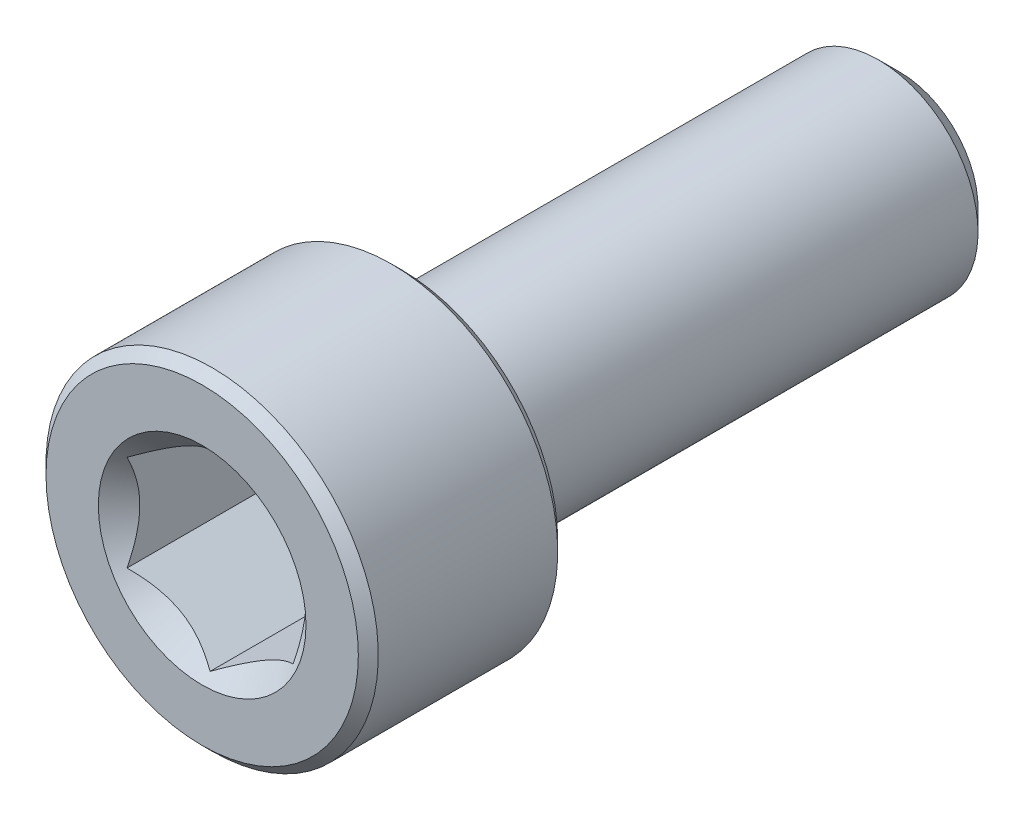
ISO-10303-21;
HEADER;
FILE_DESCRIPTION(('STEP AP214'),'2;1');
FILE_NAME('part.step','',(''),(''),'','','');
FILE_SCHEMA(('AUTOMOTIVE_DESIGN { 1 0 10303 214 1 1 1 1 }'));
ENDSEC;
DATA;
#1=APPLICATION_CONTEXT('core data for automotive mechanical design processes');
#2=APPLICATION_PROTOCOL_DEFINITION('international standard','automotive_design',2000,#1);
#3=PRODUCT_CONTEXT('',#1,'mechanical');
#4=PRODUCT('Part','Part','',(#3));
#5=PRODUCT_RELATED_PRODUCT_CATEGORY('part','',(#4));
#6=PRODUCT_DEFINITION_FORMATION('','',#4);
#7=PRODUCT_DEFINITION_CONTEXT('part definition',#1,'design');
#8=PRODUCT_DEFINITION('design','',#6,#7);
#9=PRODUCT_DEFINITION_SHAPE('','',#8);
#10=(LENGTH_UNIT() NAMED_UNIT(*) SI_UNIT(.MILLI.,.METRE.));
#11=(NAMED_UNIT(*) PLANE_ANGLE_UNIT() SI_UNIT($,.RADIAN.));
#12=(NAMED_UNIT(*) SI_UNIT($,.STERADIAN.) SOLID_ANGLE_UNIT());
#13=UNCERTAINTY_MEASURE_WITH_UNIT(LENGTH_MEASURE(1.E-05),#10,'distance_accuracy_value','');
#14=(GEOMETRIC_REPRESENTATION_CONTEXT(3) GLOBAL_UNCERTAINTY_ASSIGNED_CONTEXT((#13)) GLOBAL_UNIT_ASSIGNED_CONTEXT((#10,
#11,#12)) REPRESENTATION_CONTEXT('',''));
#15=CARTESIAN_POINT('',(0.,0.,0.));
#16=DIRECTION('',(0.,0.,1.));
#17=DIRECTION('',(1.,0.,0.));
#18=AXIS2_PLACEMENT_3D('',#15,#16,#17);
#19=CARTESIAN_POINT('',(0.,2.35048094716167,-10.5));
#20=DIRECTION('',(0.,0.,-1.));
#21=DIRECTION('',(0.,1.,0.));
#22=AXIS2_PLACEMENT_3D('',#19,#20,#21);
#23=PLANE('',#22);
#24=CARTESIAN_POINT('',(0.,0.,-10.5));
#25=DIRECTION('',(0.,0.,-1.));
#26=DIRECTION('',(0.,1.,0.));
#27=AXIS2_PLACEMENT_3D('',#24,#25,#26);
#28=CIRCLE('',#27,2.35048094716167);
#29=CARTESIAN_POINT('',(0.,2.35048094716167,-10.5));
#30=VERTEX_POINT('',#29);
#31=EDGE_CURVE('E54',#30,#30,#28,.T.);
#32=ORIENTED_EDGE('',*,*,#31,.T.);
#33=EDGE_LOOP('',(#32));
#34=FACE_BOUND('',#33,.T.);
#35=ADVANCED_FACE('F41',(#34),#23,.T.);
#36=CARTESIAN_POINT('',(0.,0.,-10.5));
#37=DIRECTION('',(0.,0.,1.));
#38=DIRECTION('',(0.,-1.,0.));
#39=AXIS2_PLACEMENT_3D('',#36,#37,#38);
#40=CONICAL_SURFACE('',#39,2.35048094716167,0.785398163397447);
#41=CARTESIAN_POINT('',(0.,0.,-9.85048094716167));
#42=DIRECTION('',(0.,0.,-1.));
#43=DIRECTION('',(0.,1.,0.));
#44=AXIS2_PLACEMENT_3D('',#41,#42,#43);
#45=CIRCLE('',#44,3.);
#46=CARTESIAN_POINT('',(0.,3.,-9.85048094716167));
#47=VERTEX_POINT('',#46);
#48=EDGE_CURVE('E157',#47,#47,#45,.T.);
#49=ORIENTED_EDGE('',*,*,#48,.T.);
#50=EDGE_LOOP('',(#49));
#51=FACE_BOUND('',#50,.T.);
#52=ORIENTED_EDGE('',*,*,#31,.F.);
#53=EDGE_LOOP('',(#52));
#54=FACE_BOUND('',#53,.T.);
#55=ADVANCED_FACE('F163',(#51,#54),#40,.T.);
#56=CARTESIAN_POINT('',(0.,0.,-10.5));
#57=DIRECTION('',(0.,0.,-1.));
#58=DIRECTION('',(0.,1.,0.));
#59=AXIS2_PLACEMENT_3D('',#56,#57,#58);
#60=CYLINDRICAL_SURFACE('',#59,3.);
#61=CARTESIAN_POINT('',(0.,0.,4.2));
#62=DIRECTION('',(0.,0.,-1.));
#63=DIRECTION('',(0.,1.,0.));
#64=AXIS2_PLACEMENT_3D('',#61,#62,#63);
#65=CIRCLE('',#64,3.);
#66=CARTESIAN_POINT('',(0.,3.,4.2));
#67=VERTEX_POINT('',#66);
#68=EDGE_CURVE('E154',#67,#67,#65,.T.);
#69=ORIENTED_EDGE('',*,*,#68,.T.);
#70=EDGE_LOOP('',(#69));
#71=FACE_BOUND('',#70,.T.);
#72=ORIENTED_EDGE('',*,*,#48,.F.);
#73=EDGE_LOOP('',(#72));
#74=FACE_BOUND('',#73,.T.);
#75=ADVANCED_FACE('F165',(#71,#74),#60,.T.);
#76=CARTESIAN_POINT('',(0.,0.,4.2));
#77=DIRECTION('',(0.,0.,-1.));
#78=DIRECTION('',(0.,1.,0.));
#79=AXIS2_PLACEMENT_3D('',#76,#77,#78);
#80=TOROIDAL_SURFACE('',#79,3.3,0.299999999999999);
#81=CARTESIAN_POINT('',(0.,0.,4.5));
#82=DIRECTION('',(0.,0.,-1.));
#83=DIRECTION('',(0.,1.,0.));
#84=AXIS2_PLACEMENT_3D('',#81,#82,#83);
#85=CIRCLE('',#84,3.3);
#86=CARTESIAN_POINT('',(0.,3.3,4.5));
#87=VERTEX_POINT('',#86);
#88=EDGE_CURVE('E151',#87,#87,#85,.T.);
#89=ORIENTED_EDGE('',*,*,#88,.T.);
#90=EDGE_LOOP('',(#89));
#91=FACE_BOUND('',#90,.T.);
#92=ORIENTED_EDGE('',*,*,#68,.F.);
#93=EDGE_LOOP('',(#92));
#94=FACE_BOUND('',#93,.T.);
#95=ADVANCED_FACE('F171',(#91,#94),#80,.F.);
#96=CARTESIAN_POINT('',(0.,4.7,4.5));
#97=DIRECTION('',(0.,0.,-1.));
#98=DIRECTION('',(0.,1.,0.));
#99=AXIS2_PLACEMENT_3D('',#96,#97,#98);
#100=PLANE('',#99);
#101=CARTESIAN_POINT('',(0.,0.,4.5));
#102=DIRECTION('',(0.,0.,-1.));
#103=DIRECTION('',(0.,1.,0.));
#104=AXIS2_PLACEMENT_3D('',#101,#102,#103);
#105=CIRCLE('',#104,4.7);
#106=CARTESIAN_POINT('',(0.,4.7,4.5));
#107=VERTEX_POINT('',#106);
#108=EDGE_CURVE('E148',#107,#107,#105,.T.);
#109=ORIENTED_EDGE('',*,*,#108,.T.);
#110=EDGE_LOOP('',(#109));
#111=FACE_BOUND('',#110,.T.);
#112=ORIENTED_EDGE('',*,*,#88,.F.);
#113=EDGE_LOOP('',(#112));
#114=FACE_BOUND('',#113,.T.);
#115=ADVANCED_FACE('F177',(#111,#114),#100,.T.);
#116=CARTESIAN_POINT('',(0.,0.,4.5));
#117=DIRECTION('',(0.,0.,1.));
#118=DIRECTION('',(0.,-1.,0.));
#119=AXIS2_PLACEMENT_3D('',#116,#117,#118);
#120=CONICAL_SURFACE('',#119,4.7,0.785398163397451);
#121=CARTESIAN_POINT('',(0.,0.,4.8));
#122=DIRECTION('',(0.,0.,-1.));
#123=DIRECTION('',(0.,1.,0.));
#124=AXIS2_PLACEMENT_3D('',#121,#122,#123);
#125=CIRCLE('',#124,5.);
#126=CARTESIAN_POINT('',(0.,5.,4.8));
#127=VERTEX_POINT('',#126);
#128=EDGE_CURVE('E145',#127,#127,#125,.T.);
#129=ORIENTED_EDGE('',*,*,#128,.T.);
#130=EDGE_LOOP('',(#129));
#131=FACE_BOUND('',#130,.T.);
#132=ORIENTED_EDGE('',*,*,#108,.F.);
#133=EDGE_LOOP('',(#132));
#134=FACE_BOUND('',#133,.T.);
#135=ADVANCED_FACE('F181',(#131,#134),#120,.T.);
#136=CARTESIAN_POINT('',(0.,0.,-10.5));
#137=DIRECTION('',(0.,0.,-1.));
#138=DIRECTION('',(0.,1.,0.));
#139=AXIS2_PLACEMENT_3D('',#136,#137,#138);
#140=CYLINDRICAL_SURFACE('',#139,5.);
#141=CARTESIAN_POINT('',(0.,0.,10.2));
#142=DIRECTION('',(0.,0.,-1.));
#143=DIRECTION('',(0.,1.,0.));
#144=AXIS2_PLACEMENT_3D('',#141,#142,#143);
#145=CIRCLE('',#144,5.);
#146=CARTESIAN_POINT('',(0.,5.,10.2));
#147=VERTEX_POINT('',#146);
#148=EDGE_CURVE('E142',#147,#147,#145,.T.);
#149=ORIENTED_EDGE('',*,*,#148,.T.);
#150=EDGE_LOOP('',(#149));
#151=FACE_BOUND('',#150,.T.);
#152=ORIENTED_EDGE('',*,*,#128,.F.);
#153=EDGE_LOOP('',(#152));
#154=FACE_BOUND('',#153,.T.);
#155=ADVANCED_FACE('F185',(#151,#154),#140,.T.);
#156=CARTESIAN_POINT('',(0.,0.,10.2));
#157=DIRECTION('',(0.,0.,-1.));
#158=DIRECTION('',(0.,1.,0.));
#159=AXIS2_PLACEMENT_3D('',#156,#157,#158);
#160=CONICAL_SURFACE('',#159,5.,0.785398163397445);
#161=CARTESIAN_POINT('',(0.,0.,10.5));
#162=DIRECTION('',(0.,0.,-1.));
#163=DIRECTION('',(0.,1.,0.));
#164=AXIS2_PLACEMENT_3D('',#161,#162,#163);
#165=CIRCLE('',#164,4.7);
#166=CARTESIAN_POINT('',(0.,4.7,10.5));
#167=VERTEX_POINT('',#166);
#168=EDGE_CURVE('E139',#167,#167,#165,.T.);
#169=ORIENTED_EDGE('',*,*,#168,.T.);
#170=EDGE_LOOP('',(#169));
#171=FACE_BOUND('',#170,.T.);
#172=ORIENTED_EDGE('',*,*,#148,.F.);
#173=EDGE_LOOP('',(#172));
#174=FACE_BOUND('',#173,.T.);
#175=ADVANCED_FACE('F189',(#171,#174),#160,.T.);
#176=CARTESIAN_POINT('',(0.,0.,10.5));
#177=DIRECTION('',(0.,0.,1.));
#178=DIRECTION('',(0.,-1.,0.));
#179=AXIS2_PLACEMENT_3D('',#176,#177,#178);
#180=PLANE('',#179);
#181=CARTESIAN_POINT('',(0.,0.,10.5));
#182=DIRECTION('',(0.,0.,1.));
#183=DIRECTION('',(1.,0.,0.));
#184=AXIS2_PLACEMENT_3D('',#181,#182,#183);
#185=CIRCLE('',#184,3.125);
#186=CARTESIAN_POINT('',(3.125,0.,10.5));
#187=VERTEX_POINT('',#186);
#188=EDGE_CURVE('E113',#187,#187,#185,.T.);
#189=ORIENTED_EDGE('',*,*,#188,.F.);
#190=EDGE_LOOP('',(#189));
#191=FACE_BOUND('',#190,.T.);
#192=ORIENTED_EDGE('',*,*,#168,.F.);
#193=EDGE_LOOP('',(#192));
#194=FACE_BOUND('',#193,.T.);
#195=ADVANCED_FACE('F193',(#191,#194),#180,.T.);
#196=CARTESIAN_POINT('',(0.,0.,10.5));
#197=DIRECTION('',(0.,0.,1.));
#198=DIRECTION('',(1.,0.,0.));
#199=AXIS2_PLACEMENT_3D('',#196,#197,#198);
#200=CONICAL_SURFACE('',#199,3.125,0.78539816339745);
#201=ORIENTED_EDGE('',*,*,#188,.T.);
#202=EDGE_LOOP('',(#201));
#203=FACE_BOUND('',#202,.T.);
#204=CARTESIAN_POINT('',(-0.000200000000000056,-2.88686681600197,10.2618668229299));
#205=CARTESIAN_POINT('',(0.0857382777877649,-2.83725032818751,10.2122920513029));
#206=CARTESIAN_POINT('',(0.173113567275753,-2.7868041812811,10.1656288273106));
#207=CARTESIAN_POINT('',(0.351281456165589,-2.6839389026696,10.0801894859864));
#208=CARTESIAN_POINT('',(0.442091000681075,-2.6315099876986,10.0414609083541));
#209=CARTESIAN_POINT('',(0.625204123126921,-2.52578957716234,9.97511804984587));
#210=CARTESIAN_POINT('',(0.71746106452934,-2.47252500720904,9.94733701447898));
#211=CARTESIAN_POINT('',(0.904006008776285,-2.3648232334321,9.9045345218588));
#212=CARTESIAN_POINT('',(0.998288312566282,-2.31038931995913,9.88948111261947));
#213=CARTESIAN_POINT('',(1.16077825829184,-2.21657570605387,9.87589906815761));
#214=CARTESIAN_POINT('',(1.22877596788015,-2.17731721011878,9.87388844518893));
#215=CARTESIAN_POINT('',(1.36466024116922,-2.0988643883567,9.87727546313562));
#216=CARTESIAN_POINT('',(1.43254675755224,-2.05967008984862,9.88267570124795));
#217=CARTESIAN_POINT('',(1.56767878823611,-1.98165157555715,9.9005771343506));
#218=CARTESIAN_POINT('',(1.63492349975356,-1.94282782326097,9.91308627299461));
#219=CARTESIAN_POINT('',(1.7682501008182,-1.86585167424616,9.94451884790384));
#220=CARTESIAN_POINT('',(1.83433207909966,-1.82769922629678,9.96344179244495));
#221=CARTESIAN_POINT('',(2.00359634669126,-1.72997445583858,10.0196187073564));
#222=CARTESIAN_POINT('',(2.10572912222289,-1.67100807039231,10.0611071775443));
#223=CARTESIAN_POINT('',(2.25590641494051,-1.58430317001562,10.1311453926712));
#224=CARTESIAN_POINT('',(2.30539653988261,-1.55573003305807,10.1557535980642));
#225=CARTESIAN_POINT('',(2.40346006383885,-1.49911303110426,10.2072132326634));
#226=CARTESIAN_POINT('',(2.45203400349693,-1.47106885396706,10.2340632847275));
#227=CARTESIAN_POINT('',(2.5002,-1.44326020292023,10.2618668229299));
#228=B_SPLINE_CURVE_WITH_KNOTS('',3,(#204,#205,#206,#207,#208,#209,#210,#211,#212,#213,#214,
#215,#216,#217,#218,#219,#220,#221,#222,#223,#224,#225,#226,#227),.UNSPECIFIED.,.F.,.F.,(4,2,2,
2,2,2,2,2,2,2,2,4),(0.,0.333012085133924,0.667964518301398,0.997597032043298,1.32639954393844,
1.56169424147169,1.79707142102083,2.03271213522171,2.26833478775651,2.64260240809533,
2.82922877818864,3.01574133749025),.UNSPECIFIED.);
#229=CARTESIAN_POINT('',(0.,-2.88675134594813,10.2617513459481));
#230=VERTEX_POINT('',#229);
#231=CARTESIAN_POINT('',(2.5,-1.44337567297406,10.2617513459481));
#232=VERTEX_POINT('',#231);
#233=EDGE_CURVE('E12',#230,#232,#228,.T.);
#234=ORIENTED_EDGE('',*,*,#233,.F.);
#235=CARTESIAN_POINT('',(-2.5002,-1.44326020292023,10.2618668229299));
#236=CARTESIAN_POINT('',(-2.41426172221224,-1.49287669073469,10.2122920513029));
#237=CARTESIAN_POINT('',(-2.32688643272425,-1.5433228376411,10.1656288273106));
#238=CARTESIAN_POINT('',(-2.14871854383441,-1.64618811625259,10.0801894859864));
#239=CARTESIAN_POINT('',(-2.05790899931892,-1.69861703122359,10.0414609083541));
#240=CARTESIAN_POINT('',(-1.87479587687308,-1.80433744175986,9.97511804984587));
#241=CARTESIAN_POINT('',(-1.78253893547066,-1.85760201171315,9.94733701447898));
#242=CARTESIAN_POINT('',(-1.59599399122371,-1.96530378549009,9.9045345218588));
#243=CARTESIAN_POINT('',(-1.50171168743372,-2.01973769896307,9.88948111261947));
#244=CARTESIAN_POINT('',(-1.33922174170816,-2.11355131286833,9.87589906815761));
#245=CARTESIAN_POINT('',(-1.27122403211985,-2.15280980880341,9.87388844518893));
#246=CARTESIAN_POINT('',(-1.13533975883078,-2.23126263056549,9.87727546313562));
#247=CARTESIAN_POINT('',(-1.06745324244776,-2.27045692907357,9.88267570124795));
#248=CARTESIAN_POINT('',(-0.932321211763895,-2.34847544336505,9.9005771343506));
#249=CARTESIAN_POINT('',(-0.865076500246441,-2.38729919566123,9.91308627299461));
#250=CARTESIAN_POINT('',(-0.731749899181802,-2.46427534467603,9.94451884790384));
#251=CARTESIAN_POINT('',(-0.665667920900344,-2.50242779262542,9.96344179244495));
#252=CARTESIAN_POINT('',(-0.496403653308736,-2.60015256308362,10.0196187073564));
#253=CARTESIAN_POINT('',(-0.394270877777108,-2.65911894852989,10.0611071775443));
#254=CARTESIAN_POINT('',(-0.244093585059491,-2.74582384890657,10.1311453926712));
#255=CARTESIAN_POINT('',(-0.19460346011739,-2.77439698586412,10.1557535980642));
#256=CARTESIAN_POINT('',(-0.0965399361611525,-2.83101398781794,10.2072132326634));
#257=CARTESIAN_POINT('',(-0.0479659965030715,-2.85905816495513,10.2340632847275));
#258=CARTESIAN_POINT('',(0.000200000000000305,-2.88686681600197,10.2618668229299));
#259=B_SPLINE_CURVE_WITH_KNOTS('',3,(#235,#236,#237,#238,#239,#240,#241,#242,#243,#244,#245,
#246,#247,#248,#249,#250,#251,#252,#253,#254,#255,#256,#257,#258),.UNSPECIFIED.,.F.,.F.,(4,2,2,
2,2,2,2,2,2,2,2,4),(0.,0.333012085133924,0.667964518301397,0.997597032043299,1.32639954393844,
1.56169424147168,1.79707142102083,2.03271213522171,2.2683347877565,2.64260240809533,
2.82922877818864,3.01574133749025),.UNSPECIFIED.);
#260=CARTESIAN_POINT('',(-2.5,-1.44337567297406,10.2617513459481));
#261=VERTEX_POINT('',#260);
#262=EDGE_CURVE('E99',#261,#230,#259,.T.);
#263=ORIENTED_EDGE('',*,*,#262,.F.);
#264=CARTESIAN_POINT('',(-2.5,-3.05811902614614,11.3249483513176));
#265=CARTESIAN_POINT('',(-2.5,-2.98440983945656,11.2678941624606));
#266=CARTESIAN_POINT('',(-2.5,-2.91030875691711,11.211338408655));
#267=CARTESIAN_POINT('',(-2.5,-2.76116077091499,11.0994529908989));
#268=CARTESIAN_POINT('',(-2.5,-2.68611365209695,11.0441236143263));
#269=CARTESIAN_POINT('',(-2.5,-2.53436379087041,10.9345266506783));
#270=CARTESIAN_POINT('',(-2.5,-2.45765275083383,10.8802705155369));
#271=CARTESIAN_POINT('',(-2.5,-2.30296317551963,10.7736026001631));
#272=CARTESIAN_POINT('',(-2.5,-2.22498472739569,10.7211906938896));
#273=CARTESIAN_POINT('',(-2.5,-2.06236769759978,10.615263211588));
#274=CARTESIAN_POINT('',(-2.5,-1.97762830350827,10.5619016261172));
#275=CARTESIAN_POINT('',(-2.5,-1.80618229870077,10.4584430751365));
#276=CARTESIAN_POINT('',(-2.5,-1.71947594494662,10.4083456864684));
#277=CARTESIAN_POINT('',(-2.5,-1.54402392194024,10.3124525300635));
#278=CARTESIAN_POINT('',(-2.5,-1.45528486870173,10.2666447518847));
#279=CARTESIAN_POINT('',(-2.5,-1.27526975606122,10.1803657409276));
#280=CARTESIAN_POINT('',(-2.5,-1.18399493457035,10.1398919577617));
#281=CARTESIAN_POINT('',(-2.5,-1.00836471270812,10.0696282555703));
#282=CARTESIAN_POINT('',(-2.5,-0.924281821785679,10.0391640684491));
#283=CARTESIAN_POINT('',(-2.5,-0.753934603970131,9.98496243419846));
#284=CARTESIAN_POINT('',(-2.5,-0.667670141814685,9.96122540528727));
#285=CARTESIAN_POINT('',(-2.5,-0.495001348242842,9.92217521126134));
#286=CARTESIAN_POINT('',(-2.5,-0.408632911050734,9.90670602865601));
#287=CARTESIAN_POINT('',(-2.5,-0.234772754668958,9.88452108838909));
#288=CARTESIAN_POINT('',(-2.5,-0.147281287804294,9.87780339802018));
#289=CARTESIAN_POINT('',(-2.5,0.0238518936773456,9.8737182218653));
#290=CARTESIAN_POINT('',(-2.5,0.107483635135722,9.87593086761492));
#291=CARTESIAN_POINT('',(-2.5,0.274114195685814,9.88860968001105));
#292=CARTESIAN_POINT('',(-2.5,0.35711295814558,9.89907657660914));
#293=CARTESIAN_POINT('',(-2.5,0.523288144897416,9.92784213274085));
#294=CARTESIAN_POINT('',(-2.5,0.606439950061686,9.94628080314541));
#295=CARTESIAN_POINT('',(-2.5,0.770896010035104,9.989956208676));
#296=CARTESIAN_POINT('',(-2.5,0.852200351882828,10.0151926228204));
#297=CARTESIAN_POINT('',(-2.5,1.10064624940811,10.1020006776711));
#298=CARTESIAN_POINT('',(-2.5,1.26445670942465,10.1731337561378));
#299=CARTESIAN_POINT('',(-2.5,1.50421272270141,10.2918201200772));
#300=CARTESIAN_POINT('',(-2.5,1.58328419057904,10.333471615305));
#301=CARTESIAN_POINT('',(-2.5,1.73963927584191,10.4200124035774));
#302=CARTESIAN_POINT('',(-2.5,1.81692320237102,10.4649011311494));
#303=CARTESIAN_POINT('',(-2.5,1.96613896389381,10.5549912173065));
#304=CARTESIAN_POINT('',(-2.5,2.03814682362153,10.6000680708391));
#305=CARTESIAN_POINT('',(-2.5,2.18092679643222,10.6921473192976));
#306=CARTESIAN_POINT('',(-2.5,2.25169881661102,10.7391498581055));
#307=CARTESIAN_POINT('',(-2.5,2.39159945333184,10.8343550134732));
#308=CARTESIAN_POINT('',(-2.5,2.46073668867174,10.8825450175112));
#309=CARTESIAN_POINT('',(-2.5,2.59806183277128,10.9802211436377));
#310=CARTESIAN_POINT('',(-2.5,2.66624999804919,11.0297069046595));
#311=CARTESIAN_POINT('',(-2.5,2.73404006469875,11.0797233466722));
#312=B_SPLINE_CURVE_WITH_KNOTS('',3,(#264,#265,#266,#267,#268,#269,#270,#271,#272,#273,#274,
#275,#276,#277,#278,#279,#280,#281,#282,#283,#284,#285,#286,#287,#288,#289,#290,#291,#292,#293,
#294,#295,#296,#297,#298,#299,#300,#301,#302,#303,#304,#305,#306,#307,#308,#309,#310,#311),
.UNSPECIFIED.,.F.,.F.,(4,2,2,2,2,2,2,2,2,2,2,2,2,2,2,2,2,2,2,2,2,2,2,4),(0.,0.279636937737095,
0.55933872465569,0.841193583356593,1.1230291415439,1.42339426279004,1.72372036804098,
2.02317874224782,2.32249341038692,2.59055815083282,2.85863955284488,3.12146553699264,
3.38423346797086,3.6347944563997,3.88537760527732,4.14055298164195,4.39571631103123,
4.92983151325628,5.19792074748275,5.46596326536873,5.72079181091925,5.9756394314289,
6.22844778309936,6.48118642327295),.UNSPECIFIED.);
#313=CARTESIAN_POINT('',(-2.5,1.44337567297406,10.2617513459481));
#314=VERTEX_POINT('',#313);
#315=EDGE_CURVE('E112',#314,#261,#312,.F.);
#316=ORIENTED_EDGE('',*,*,#315,.F.);
#317=CARTESIAN_POINT('',(0.000199999999999188,2.88686681600197,10.2618668229299));
#318=CARTESIAN_POINT('',(-0.0857382777877659,2.83725032818751,10.2122920513029));
#319=CARTESIAN_POINT('',(-0.173113567275754,2.7868041812811,10.1656288273106));
#320=CARTESIAN_POINT('',(-0.351281456165589,2.6839389026696,10.0801894859864));
#321=CARTESIAN_POINT('',(-0.442091000681075,2.6315099876986,10.0414609083541));
#322=CARTESIAN_POINT('',(-0.625204123126921,2.52578957716234,9.97511804984587));
#323=CARTESIAN_POINT('',(-0.71746106452934,2.47252500720904,9.94733701447898));
#324=CARTESIAN_POINT('',(-0.904006008776285,2.3648232334321,9.9045345218588));
#325=CARTESIAN_POINT('',(-0.998288312566282,2.31038931995913,9.88948111261947));
#326=CARTESIAN_POINT('',(-1.16077825829184,2.21657570605387,9.87589906815761));
#327=CARTESIAN_POINT('',(-1.22877596788015,2.17731721011878,9.87388844518893));
#328=CARTESIAN_POINT('',(-1.36466024116922,2.0988643883567,9.87727546313562));
#329=CARTESIAN_POINT('',(-1.43254675755224,2.05967008984862,9.88267570124795));
#330=CARTESIAN_POINT('',(-1.5676787882361,1.98165157555715,9.9005771343506));
#331=CARTESIAN_POINT('',(-1.63492349975356,1.94282782326097,9.91308627299461));
#332=CARTESIAN_POINT('',(-1.7682501008182,1.86585167424616,9.94451884790384));
#333=CARTESIAN_POINT('',(-1.83433207909966,1.82769922629678,9.96344179244495));
#334=CARTESIAN_POINT('',(-2.00359634669126,1.72997445583858,10.0196187073564));
#335=CARTESIAN_POINT('',(-2.10572912222289,1.67100807039231,10.0611071775443));
#336=CARTESIAN_POINT('',(-2.25590641494051,1.58430317001562,10.1311453926712));
#337=CARTESIAN_POINT('',(-2.30539653988261,1.55573003305807,10.1557535980642));
#338=CARTESIAN_POINT('',(-2.40346006383885,1.49911303110426,10.2072132326634));
#339=CARTESIAN_POINT('',(-2.45203400349693,1.47106885396706,10.2340632847275));
#340=CARTESIAN_POINT('',(-2.5002,1.44326020292023,10.2618668229299));
#341=B_SPLINE_CURVE_WITH_KNOTS('',3,(#317,#318,#319,#320,#321,#322,#323,#324,#325,#326,#327,
#328,#329,#330,#331,#332,#333,#334,#335,#336,#337,#338,#339,#340),.UNSPECIFIED.,.F.,.F.,(4,2,2,
2,2,2,2,2,2,2,2,4),(0.,0.333012085133923,0.667964518301396,0.997597032043297,1.32639954393844,
1.56169424147168,1.79707142102082,2.0327121352217,2.2683347877565,2.64260240809533,
2.82922877818863,3.01574133749025),.UNSPECIFIED.);
#342=CARTESIAN_POINT('',(0.,2.88675134594813,10.2617513459481));
#343=VERTEX_POINT('',#342);
#344=EDGE_CURVE('E243',#343,#314,#341,.T.);
#345=ORIENTED_EDGE('',*,*,#344,.F.);
#346=CARTESIAN_POINT('',(2.5002,1.44326020292023,10.2618668229299));
#347=CARTESIAN_POINT('',(2.41426172221224,1.49287669073468,10.2122920513029));
#348=CARTESIAN_POINT('',(2.32688643272425,1.5433228376411,10.1656288273106));
#349=CARTESIAN_POINT('',(2.14871854383441,1.64618811625259,10.0801894859864));
#350=CARTESIAN_POINT('',(2.05790899931892,1.69861703122359,10.0414609083541));
#351=CARTESIAN_POINT('',(1.87479587687308,1.80433744175986,9.97511804984587));
#352=CARTESIAN_POINT('',(1.78253893547066,1.85760201171315,9.94733701447898));
#353=CARTESIAN_POINT('',(1.59599399122371,1.96530378549009,9.90453452185879));
#354=CARTESIAN_POINT('',(1.50171168743372,2.01973769896307,9.88948111261947));
#355=CARTESIAN_POINT('',(1.33922174170815,2.11355131286833,9.87589906815761));
#356=CARTESIAN_POINT('',(1.27122403211985,2.15280980880341,9.87388844518893));
#357=CARTESIAN_POINT('',(1.13533975883078,2.23126263056549,9.87727546313562));
#358=CARTESIAN_POINT('',(1.06745324244776,2.27045692907357,9.88267570124795));
#359=CARTESIAN_POINT('',(0.932321211763893,2.34847544336505,9.9005771343506));
#360=CARTESIAN_POINT('',(0.865076500246439,2.38729919566123,9.91308627299461));
#361=CARTESIAN_POINT('',(0.7317498991818,2.46427534467603,9.94451884790384));
#362=CARTESIAN_POINT('',(0.665667920900342,2.50242779262542,9.96344179244495));
#363=CARTESIAN_POINT('',(0.496403653308734,2.60015256308362,10.0196187073564));
#364=CARTESIAN_POINT('',(0.394270877777106,2.65911894852989,10.0611071775443));
#365=CARTESIAN_POINT('',(0.244093585059491,2.74582384890657,10.1311453926712));
#366=CARTESIAN_POINT('',(0.19460346011739,2.77439698586412,10.1557535980642));
#367=CARTESIAN_POINT('',(0.0965399361611525,2.83101398781794,10.2072132326634));
#368=CARTESIAN_POINT('',(0.0479659965030713,2.85905816495513,10.2340632847275));
#369=CARTESIAN_POINT('',(-0.000200000000000713,2.88686681600197,10.2618668229299));
#370=B_SPLINE_CURVE_WITH_KNOTS('',3,(#346,#347,#348,#349,#350,#351,#352,#353,#354,#355,#356,
#357,#358,#359,#360,#361,#362,#363,#364,#365,#366,#367,#368,#369),.UNSPECIFIED.,.F.,.F.,(4,2,2,
2,2,2,2,2,2,2,2,4),(0.,0.333012085133925,0.667964518301398,0.997597032043301,1.32639954393844,
1.56169424147169,1.79707142102083,2.03271213522171,2.26833478775651,2.64260240809533,
2.82922877818864,3.01574133749025),.UNSPECIFIED.);
#371=CARTESIAN_POINT('',(2.5,1.44337567297406,10.2617513459481));
#372=VERTEX_POINT('',#371);
#373=EDGE_CURVE('E216',#372,#343,#370,.T.);
#374=ORIENTED_EDGE('',*,*,#373,.F.);
#375=CARTESIAN_POINT('',(2.5,-3.05811902614614,11.3249483513176));
#376=CARTESIAN_POINT('',(2.5,-2.98440983945656,11.2678941624606));
#377=CARTESIAN_POINT('',(2.5,-2.91030875691711,11.211338408655));
#378=CARTESIAN_POINT('',(2.5,-2.76116077091499,11.0994529908989));
#379=CARTESIAN_POINT('',(2.5,-2.68611365209695,11.0441236143263));
#380=CARTESIAN_POINT('',(2.5,-2.53436379087041,10.9345266506783));
#381=CARTESIAN_POINT('',(2.5,-2.45765275083384,10.8802705155369));
#382=CARTESIAN_POINT('',(2.5,-2.30296317551963,10.7736026001631));
#383=CARTESIAN_POINT('',(2.5,-2.2249847273957,10.7211906938896));
#384=CARTESIAN_POINT('',(2.5,-2.06236769759978,10.615263211588));
#385=CARTESIAN_POINT('',(2.5,-1.97762830350827,10.5619016261172));
#386=CARTESIAN_POINT('',(2.5,-1.80618229870077,10.4584430751365));
#387=CARTESIAN_POINT('',(2.5,-1.71947594494662,10.4083456864684));
#388=CARTESIAN_POINT('',(2.5,-1.54402392194024,10.3124525300635));
#389=CARTESIAN_POINT('',(2.5,-1.45528486870173,10.2666447518847));
#390=CARTESIAN_POINT('',(2.5,-1.27526975606122,10.1803657409276));
#391=CARTESIAN_POINT('',(2.5,-1.18399493457035,10.1398919577617));
#392=CARTESIAN_POINT('',(2.5,-1.00836471270812,10.0696282555703));
#393=CARTESIAN_POINT('',(2.5,-0.924281821785679,10.0391640684491));
#394=CARTESIAN_POINT('',(2.5,-0.753934603970131,9.98496243419846));
#395=CARTESIAN_POINT('',(2.5,-0.667670141814685,9.96122540528727));
#396=CARTESIAN_POINT('',(2.5,-0.495001348242842,9.92217521126134));
#397=CARTESIAN_POINT('',(2.5,-0.408632911050733,9.90670602865601));
#398=CARTESIAN_POINT('',(2.5,-0.234772754668958,9.88452108838909));
#399=CARTESIAN_POINT('',(2.5,-0.147281287804293,9.87780339802018));
#400=CARTESIAN_POINT('',(2.5,0.0238518936773465,9.8737182218653));
#401=CARTESIAN_POINT('',(2.5,0.107483635135723,9.87593086761492));
#402=CARTESIAN_POINT('',(2.5,0.274114195685815,9.88860968001105));
#403=CARTESIAN_POINT('',(2.5,0.357112958145581,9.89907657660914));
#404=CARTESIAN_POINT('',(2.5,0.523288144897418,9.92784213274086));
#405=CARTESIAN_POINT('',(2.5,0.606439950061688,9.94628080314541));
#406=CARTESIAN_POINT('',(2.5,0.770896010035105,9.989956208676));
#407=CARTESIAN_POINT('',(2.5,0.85220035188283,10.0151926228204));
#408=CARTESIAN_POINT('',(2.5,1.10064624940811,10.1020006776711));
#409=CARTESIAN_POINT('',(2.5,1.26445670942465,10.1731337561378));
#410=CARTESIAN_POINT('',(2.5,1.50421272270141,10.2918201200772));
#411=CARTESIAN_POINT('',(2.5,1.58328419057904,10.333471615305));
#412=CARTESIAN_POINT('',(2.5,1.73963927584192,10.4200124035774));
#413=CARTESIAN_POINT('',(2.5,1.81692320237102,10.4649011311494));
#414=CARTESIAN_POINT('',(2.5,1.96613896389381,10.5549912173065));
#415=CARTESIAN_POINT('',(2.5,2.03814682362154,10.6000680708391));
#416=CARTESIAN_POINT('',(2.5,2.18092679643222,10.6921473192976));
#417=CARTESIAN_POINT('',(2.5,2.25169881661102,10.7391498581055));
#418=CARTESIAN_POINT('',(2.5,2.39159945333184,10.8343550134732));
#419=CARTESIAN_POINT('',(2.5,2.46073668867174,10.8825450175112));
#420=CARTESIAN_POINT('',(2.5,2.59806183277128,10.9802211436377));
#421=CARTESIAN_POINT('',(2.5,2.6662499980492,11.0297069046595));
#422=CARTESIAN_POINT('',(2.5,2.73404006469875,11.0797233466722));
#423=B_SPLINE_CURVE_WITH_KNOTS('',3,(#375,#376,#377,#378,#379,#380,#381,#382,#383,#384,#385,
#386,#387,#388,#389,#390,#391,#392,#393,#394,#395,#396,#397,#398,#399,#400,#401,#402,#403,#404,
#405,#406,#407,#408,#409,#410,#411,#412,#413,#414,#415,#416,#417,#418,#419,#420,#421,#422),
.UNSPECIFIED.,.F.,.F.,(4,2,2,2,2,2,2,2,2,2,2,2,2,2,2,2,2,2,2,2,2,2,2,4),(0.,0.279636937737094,
0.559338724655691,0.841193583356593,1.1230291415439,1.42339426279004,1.72372036804098,
2.02317874224782,2.32249341038693,2.59055815083283,2.85863955284489,3.12146553699265,
3.38423346797087,3.6347944563997,3.88537760527732,4.14055298164195,4.39571631103123,
4.92983151325628,5.19792074748275,5.46596326536874,5.72079181091925,5.97563943142891,
6.22844778309936,6.48118642327296),.UNSPECIFIED.);
#424=EDGE_CURVE('E61',#232,#372,#423,.T.);
#425=ORIENTED_EDGE('',*,*,#424,.F.);
#426=EDGE_LOOP('',(#234,#263,#316,#345,#374,#425));
#427=FACE_BOUND('',#426,.T.);
#428=ADVANCED_FACE('F98',(#203,#427),#200,.F.);
#429=CARTESIAN_POINT('',(0.,4.7,5.5));
#430=DIRECTION('',(0.,0.,-1.));
#431=DIRECTION('',(0.,1.,0.));
#432=AXIS2_PLACEMENT_3D('',#429,#430,#431);
#433=PLANE('',#432);
#434=DIRECTION('',(0.866025403784439,0.5,0.));
#435=VECTOR('',#434,1.);
#436=CARTESIAN_POINT('',(0.,-2.88675134594813,5.5));
#437=LINE('',#436,#435);
#438=CARTESIAN_POINT('',(0.,-2.88675134594813,5.5));
#439=VERTEX_POINT('',#438);
#440=CARTESIAN_POINT('',(2.5,-1.44337567297406,5.5));
#441=VERTEX_POINT('',#440);
#442=EDGE_CURVE('E116',#439,#441,#437,.T.);
#443=ORIENTED_EDGE('',*,*,#442,.T.);
#444=DIRECTION('',(0.,1.,0.));
#445=VECTOR('',#444,1.);
#446=CARTESIAN_POINT('',(2.5,-1.44337567297406,5.5));
#447=LINE('',#446,#445);
#448=CARTESIAN_POINT('',(2.5,1.44337567297406,5.5));
#449=VERTEX_POINT('',#448);
#450=EDGE_CURVE('E68',#441,#449,#447,.T.);
#451=ORIENTED_EDGE('',*,*,#450,.T.);
#452=DIRECTION('',(-0.866025403784439,0.5,0.));
#453=VECTOR('',#452,1.);
#454=CARTESIAN_POINT('',(2.5,1.44337567297406,5.5));
#455=LINE('',#454,#453);
#456=CARTESIAN_POINT('',(0.,2.88675134594813,5.5));
#457=VERTEX_POINT('',#456);
#458=EDGE_CURVE('E124',#449,#457,#455,.T.);
#459=ORIENTED_EDGE('',*,*,#458,.T.);
#460=DIRECTION('',(-0.866025403784439,-0.5,0.));
#461=VECTOR('',#460,1.);
#462=CARTESIAN_POINT('',(0.,2.88675134594813,5.5));
#463=LINE('',#462,#461);
#464=CARTESIAN_POINT('',(-2.5,1.44337567297406,5.5));
#465=VERTEX_POINT('',#464);
#466=EDGE_CURVE('E131',#457,#465,#463,.T.);
#467=ORIENTED_EDGE('',*,*,#466,.T.);
#468=DIRECTION('',(0.,-1.,0.));
#469=VECTOR('',#468,1.);
#470=CARTESIAN_POINT('',(-2.5,1.44337567297406,5.5));
#471=LINE('',#470,#469);
#472=CARTESIAN_POINT('',(-2.5,-1.44337567297406,5.5));
#473=VERTEX_POINT('',#472);
#474=EDGE_CURVE('E127',#465,#473,#471,.T.);
#475=ORIENTED_EDGE('',*,*,#474,.T.);
#476=DIRECTION('',(0.866025403784439,-0.5,0.));
#477=VECTOR('',#476,1.);
#478=CARTESIAN_POINT('',(-2.5,-1.44337567297406,5.5));
#479=LINE('',#478,#477);
#480=EDGE_CURVE('E117',#473,#439,#479,.T.);
#481=ORIENTED_EDGE('',*,*,#480,.T.);
#482=EDGE_LOOP('',(#443,#451,#459,#467,#475,#481));
#483=FACE_BOUND('',#482,.T.);
#484=ADVANCED_FACE('F198',(#483),#433,.F.);
#485=CARTESIAN_POINT('',(0.,-2.88675134594813,-3.13762615825973));
#486=DIRECTION('',(0.5,-0.866025403784439,0.));
#487=DIRECTION('',(0.866025403784439,0.5,0.));
#488=AXIS2_PLACEMENT_3D('',#485,#486,#487);
#489=PLANE('',#488);
#490=DIRECTION('',(0.,0.,1.));
#491=VECTOR('',#490,1.);
#492=CARTESIAN_POINT('',(0.,-2.88675134594813,-3.13762615825973));
#493=LINE('',#492,#491);
#494=EDGE_CURVE('E108',#439,#230,#493,.T.);
#495=ORIENTED_EDGE('',*,*,#494,.T.);
#496=ORIENTED_EDGE('',*,*,#233,.T.);
#497=DIRECTION('',(0.,0.,1.));
#498=VECTOR('',#497,1.);
#499=CARTESIAN_POINT('',(2.5,-1.44337567297406,-3.13762615825973));
#500=LINE('',#499,#498);
#501=EDGE_CURVE('E119',#441,#232,#500,.T.);
#502=ORIENTED_EDGE('',*,*,#501,.F.);
#503=ORIENTED_EDGE('',*,*,#442,.F.);
#504=EDGE_LOOP('',(#495,#496,#502,#503));
#505=FACE_BOUND('',#504,.T.);
#506=ADVANCED_FACE('F115',(#505),#489,.F.);
#507=CARTESIAN_POINT('',(-2.5,-1.44337567297406,-3.13762615825973));
#508=DIRECTION('',(-0.5,-0.866025403784439,0.));
#509=DIRECTION('',(0.866025403784439,-0.5,0.));
#510=AXIS2_PLACEMENT_3D('',#507,#508,#509);
#511=PLANE('',#510);
#512=DIRECTION('',(0.,0.,1.));
#513=VECTOR('',#512,1.);
#514=CARTESIAN_POINT('',(-2.5,-1.44337567297406,-3.13762615825973));
#515=LINE('',#514,#513);
#516=EDGE_CURVE('E111',#473,#261,#515,.T.);
#517=ORIENTED_EDGE('',*,*,#516,.T.);
#518=ORIENTED_EDGE('',*,*,#262,.T.);
#519=ORIENTED_EDGE('',*,*,#494,.F.);
#520=ORIENTED_EDGE('',*,*,#480,.F.);
#521=EDGE_LOOP('',(#517,#518,#519,#520));
#522=FACE_BOUND('',#521,.T.);
#523=ADVANCED_FACE('F107',(#522),#511,.F.);
#524=CARTESIAN_POINT('',(-2.5,1.44337567297406,-3.13762615825973));
#525=DIRECTION('',(-1.,0.,0.));
#526=DIRECTION('',(0.,0.,1.));
#527=AXIS2_PLACEMENT_3D('',#524,#525,#526);
#528=PLANE('',#527);
#529=DIRECTION('',(0.,0.,1.));
#530=VECTOR('',#529,1.);
#531=CARTESIAN_POINT('',(-2.5,1.44337567297406,-3.13762615825973));
#532=LINE('',#531,#530);
#533=EDGE_CURVE('E128',#465,#314,#532,.T.);
#534=ORIENTED_EDGE('',*,*,#533,.T.);
#535=ORIENTED_EDGE('',*,*,#315,.T.);
#536=ORIENTED_EDGE('',*,*,#516,.F.);
#537=ORIENTED_EDGE('',*,*,#474,.F.);
#538=EDGE_LOOP('',(#534,#535,#536,#537));
#539=FACE_BOUND('',#538,.T.);
#540=ADVANCED_FACE('F252',(#539),#528,.F.);
#541=CARTESIAN_POINT('',(0.,2.88675134594813,-3.13762615825973));
#542=DIRECTION('',(-0.5,0.866025403784439,0.));
#543=DIRECTION('',(-0.866025403784439,-0.5,0.));
#544=AXIS2_PLACEMENT_3D('',#541,#542,#543);
#545=PLANE('',#544);
#546=DIRECTION('',(0.,0.,1.));
#547=VECTOR('',#546,1.);
#548=CARTESIAN_POINT('',(0.,2.88675134594813,-3.13762615825973));
#549=LINE('',#548,#547);
#550=EDGE_CURVE('E132',#457,#343,#549,.T.);
#551=ORIENTED_EDGE('',*,*,#550,.T.);
#552=ORIENTED_EDGE('',*,*,#344,.T.);
#553=ORIENTED_EDGE('',*,*,#533,.F.);
#554=ORIENTED_EDGE('',*,*,#466,.F.);
#555=EDGE_LOOP('',(#551,#552,#553,#554));
#556=FACE_BOUND('',#555,.T.);
#557=ADVANCED_FACE('F249',(#556),#545,.F.);
#558=CARTESIAN_POINT('',(2.5,1.44337567297406,-3.13762615825973));
#559=DIRECTION('',(0.5,0.866025403784439,0.));
#560=DIRECTION('',(-0.866025403784439,0.5,0.));
#561=AXIS2_PLACEMENT_3D('',#558,#559,#560);
#562=PLANE('',#561);
#563=DIRECTION('',(0.,0.,1.));
#564=VECTOR('',#563,1.);
#565=CARTESIAN_POINT('',(2.5,1.44337567297406,-3.13762615825973));
#566=LINE('',#565,#564);
#567=EDGE_CURVE('E135',#449,#372,#566,.T.);
#568=ORIENTED_EDGE('',*,*,#567,.T.);
#569=ORIENTED_EDGE('',*,*,#373,.T.);
#570=ORIENTED_EDGE('',*,*,#550,.F.);
#571=ORIENTED_EDGE('',*,*,#458,.F.);
#572=EDGE_LOOP('',(#568,#569,#570,#571));
#573=FACE_BOUND('',#572,.T.);
#574=ADVANCED_FACE('F206',(#573),#562,.F.);
#575=CARTESIAN_POINT('',(2.5,-1.44337567297406,-3.13762615825973));
#576=DIRECTION('',(1.,0.,0.));
#577=DIRECTION('',(0.,0.,-1.));
#578=AXIS2_PLACEMENT_3D('',#575,#576,#577);
#579=PLANE('',#578);
#580=ORIENTED_EDGE('',*,*,#501,.T.);
#581=ORIENTED_EDGE('',*,*,#424,.T.);
#582=ORIENTED_EDGE('',*,*,#567,.F.);
#583=ORIENTED_EDGE('',*,*,#450,.F.);
#584=EDGE_LOOP('',(#580,#581,#582,#583));
#585=FACE_BOUND('',#584,.T.);
#586=ADVANCED_FACE('F202',(#585),#579,.F.);
#587=CLOSED_SHELL('',(#35,#55,#75,#95,#115,#135,#155,#175,#195,#428,#484,#506,#523,#540,#557,
#574,#586));
#588=MANIFOLD_SOLID_BREP('B2',#587);
#589=ADVANCED_BREP_SHAPE_REPRESENTATION('',(#18,#588),#14);
#590=SHAPE_DEFINITION_REPRESENTATION(#9,#589);
ENDSEC;
END-ISO-10303-21;
